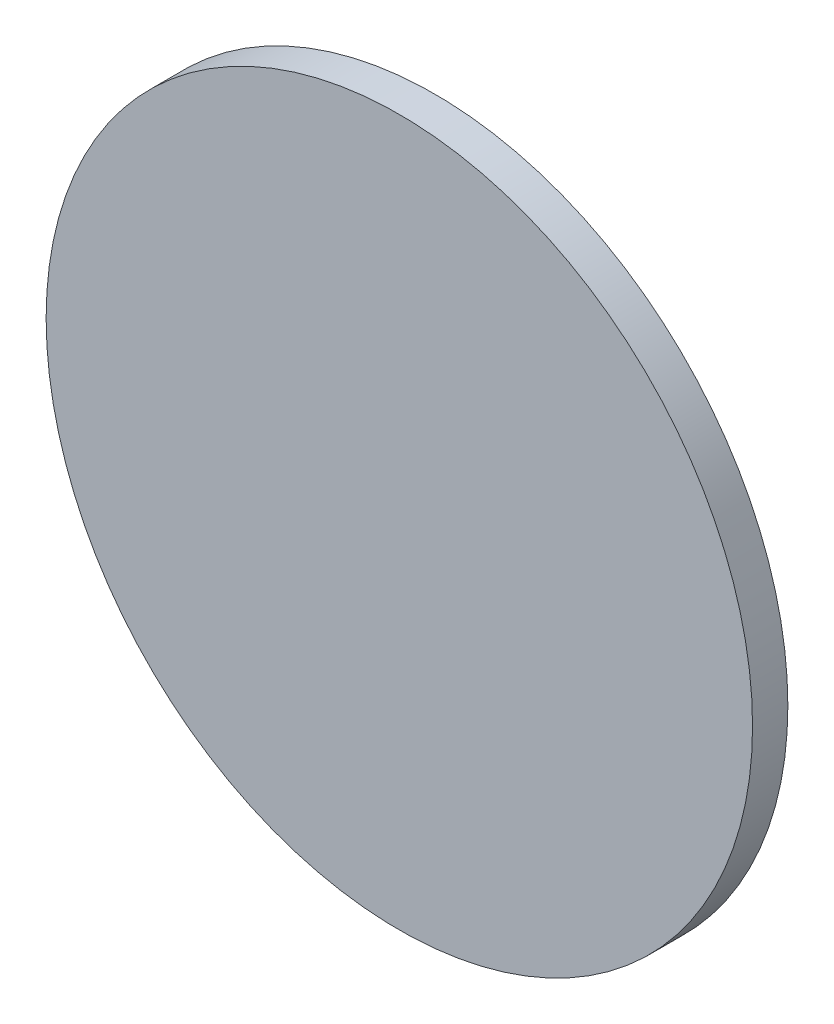
ISO-10303-21;
HEADER;
FILE_DESCRIPTION(('STEP AP214'),'2;1');
FILE_NAME('part.step','',(''),(''),'','','');
FILE_SCHEMA(('AUTOMOTIVE_DESIGN { 1 0 10303 214 1 1 1 1 }'));
ENDSEC;
DATA;
#1=APPLICATION_CONTEXT('core data for automotive mechanical design processes');
#2=APPLICATION_PROTOCOL_DEFINITION('international standard','automotive_design',2000,#1);
#3=PRODUCT_CONTEXT('',#1,'mechanical');
#4=PRODUCT('Part','Part','',(#3));
#5=PRODUCT_RELATED_PRODUCT_CATEGORY('part','',(#4));
#6=PRODUCT_DEFINITION_FORMATION('','',#4);
#7=PRODUCT_DEFINITION_CONTEXT('part definition',#1,'design');
#8=PRODUCT_DEFINITION('design','',#6,#7);
#9=PRODUCT_DEFINITION_SHAPE('','',#8);
#10=(LENGTH_UNIT() NAMED_UNIT(*) SI_UNIT(.MILLI.,.METRE.));
#11=(NAMED_UNIT(*) PLANE_ANGLE_UNIT() SI_UNIT($,.RADIAN.));
#12=(NAMED_UNIT(*) SI_UNIT($,.STERADIAN.) SOLID_ANGLE_UNIT());
#13=UNCERTAINTY_MEASURE_WITH_UNIT(LENGTH_MEASURE(1.E-05),#10,'distance_accuracy_value','');
#14=(GEOMETRIC_REPRESENTATION_CONTEXT(3) GLOBAL_UNCERTAINTY_ASSIGNED_CONTEXT((#13)) GLOBAL_UNIT_ASSIGNED_CONTEXT((#10,
#11,#12)) REPRESENTATION_CONTEXT('',''));
#15=CARTESIAN_POINT('',(0.,0.,0.));
#16=DIRECTION('',(0.,0.,1.));
#17=DIRECTION('',(1.,0.,0.));
#18=AXIS2_PLACEMENT_3D('',#15,#16,#17);
#19=CARTESIAN_POINT('',(0.,0.,4.));
#20=DIRECTION('',(0.,0.,-1.));
#21=DIRECTION('',(-1.,0.,0.));
#22=AXIS2_PLACEMENT_3D('',#19,#20,#21);
#23=CYLINDRICAL_SURFACE('',#22,40.);
#24=CARTESIAN_POINT('',(0.,0.,4.));
#25=DIRECTION('',(0.,0.,1.));
#26=DIRECTION('',(1.,0.,0.));
#27=AXIS2_PLACEMENT_3D('',#24,#25,#26);
#28=CIRCLE('',#27,40.);
#29=CARTESIAN_POINT('',(40.,0.,4.));
#30=VERTEX_POINT('',#29);
#31=EDGE_CURVE('E10',#30,#30,#28,.T.);
#32=ORIENTED_EDGE('',*,*,#31,.F.);
#33=EDGE_LOOP('',(#32));
#34=FACE_BOUND('',#33,.T.);
#35=CARTESIAN_POINT('',(0.,0.,0.));
#36=DIRECTION('',(0.,0.,1.));
#37=DIRECTION('',(1.,0.,0.));
#38=AXIS2_PLACEMENT_3D('',#35,#36,#37);
#39=CIRCLE('',#38,40.);
#40=CARTESIAN_POINT('',(40.,0.,0.));
#41=VERTEX_POINT('',#40);
#42=EDGE_CURVE('E37',#41,#41,#39,.T.);
#43=ORIENTED_EDGE('',*,*,#42,.T.);
#44=EDGE_LOOP('',(#43));
#45=FACE_BOUND('',#44,.T.);
#46=ADVANCED_FACE('F34',(#34,#45),#23,.T.);
#47=CARTESIAN_POINT('',(0.,0.,4.));
#48=DIRECTION('',(0.,0.,1.));
#49=DIRECTION('',(1.,0.,0.));
#50=AXIS2_PLACEMENT_3D('',#47,#48,#49);
#51=PLANE('',#50);
#52=ORIENTED_EDGE('',*,*,#31,.T.);
#53=EDGE_LOOP('',(#52));
#54=FACE_BOUND('',#53,.T.);
#55=ADVANCED_FACE('F49',(#54),#51,.T.);
#56=CARTESIAN_POINT('',(0.,0.,0.));
#57=DIRECTION('',(0.,0.,1.));
#58=DIRECTION('',(1.,0.,0.));
#59=AXIS2_PLACEMENT_3D('',#56,#57,#58);
#60=PLANE('',#59);
#61=ORIENTED_EDGE('',*,*,#42,.F.);
#62=EDGE_LOOP('',(#61));
#63=FACE_BOUND('',#62,.T.);
#64=ADVANCED_FACE('F47',(#63),#60,.F.);
#65=CLOSED_SHELL('',(#46,#55,#64));
#66=MANIFOLD_SOLID_BREP('B2',#65);
#67=ADVANCED_BREP_SHAPE_REPRESENTATION('',(#18,#66),#14);
#68=SHAPE_DEFINITION_REPRESENTATION(#9,#67);
ENDSEC;
END-ISO-10303-21;
